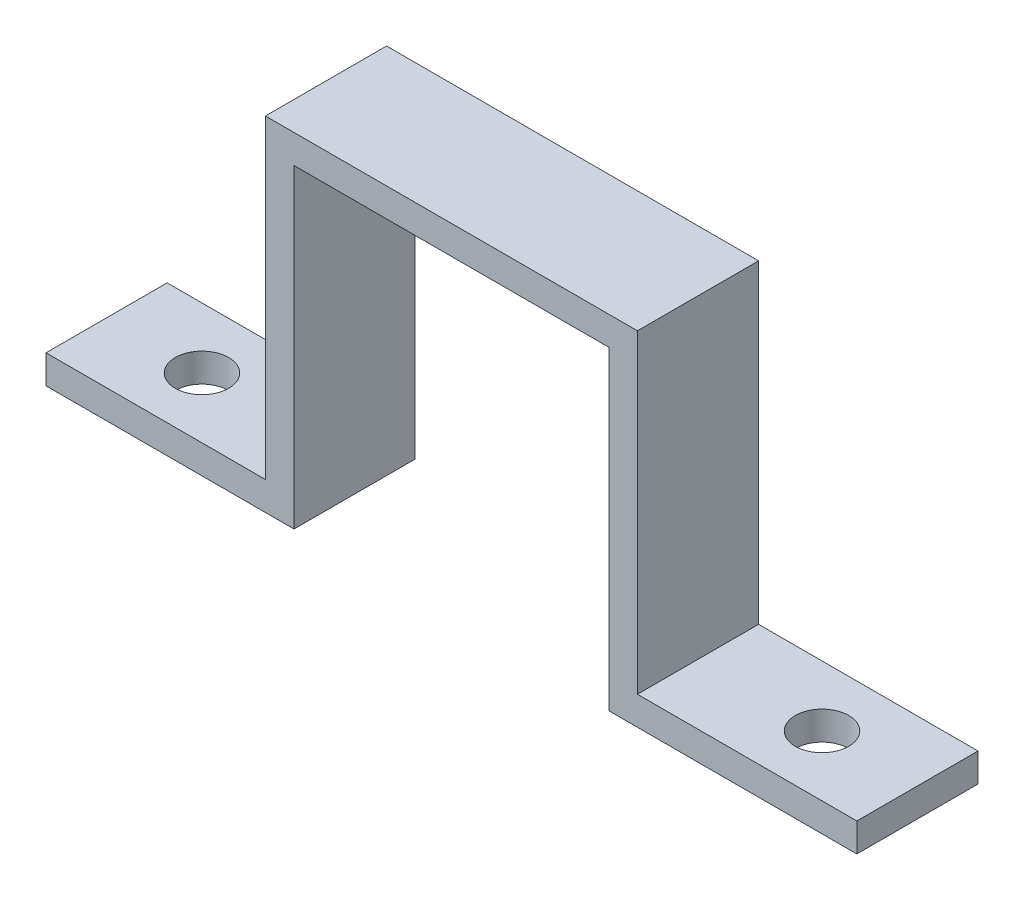
ISO-10303-21;
HEADER;
FILE_DESCRIPTION(('STEP AP214'),'2;1');
FILE_NAME('part.step','',(''),(''),'','','');
FILE_SCHEMA(('AUTOMOTIVE_DESIGN { 1 0 10303 214 1 1 1 1 }'));
ENDSEC;
DATA;
#1=APPLICATION_CONTEXT('core data for automotive mechanical design processes');
#2=APPLICATION_PROTOCOL_DEFINITION('international standard','automotive_design',2000,#1);
#3=PRODUCT_CONTEXT('',#1,'mechanical');
#4=PRODUCT('Part','Part','',(#3));
#5=PRODUCT_RELATED_PRODUCT_CATEGORY('part','',(#4));
#6=PRODUCT_DEFINITION_FORMATION('','',#4);
#7=PRODUCT_DEFINITION_CONTEXT('part definition',#1,'design');
#8=PRODUCT_DEFINITION('design','',#6,#7);
#9=PRODUCT_DEFINITION_SHAPE('','',#8);
#10=(LENGTH_UNIT() NAMED_UNIT(*) SI_UNIT(.MILLI.,.METRE.));
#11=(NAMED_UNIT(*) PLANE_ANGLE_UNIT() SI_UNIT($,.RADIAN.));
#12=(NAMED_UNIT(*) SI_UNIT($,.STERADIAN.) SOLID_ANGLE_UNIT());
#13=UNCERTAINTY_MEASURE_WITH_UNIT(LENGTH_MEASURE(1.E-05),#10,'distance_accuracy_value','');
#14=(GEOMETRIC_REPRESENTATION_CONTEXT(3) GLOBAL_UNCERTAINTY_ASSIGNED_CONTEXT((#13)) GLOBAL_UNIT_ASSIGNED_CONTEXT((#10,
#11,#12)) REPRESENTATION_CONTEXT('',''));
#15=CARTESIAN_POINT('',(0.,0.,0.));
#16=DIRECTION('',(0.,0.,1.));
#17=DIRECTION('',(1.,0.,0.));
#18=AXIS2_PLACEMENT_3D('',#15,#16,#17);
#19=CARTESIAN_POINT('',(-42.5,3.,-6.35));
#20=DIRECTION('',(0.,1.,0.));
#21=DIRECTION('',(0.,0.,1.));
#22=AXIS2_PLACEMENT_3D('',#19,#20,#21);
#23=PLANE('',#22);
#24=CARTESIAN_POINT('',(-32.5,3.,0.));
#25=DIRECTION('',(0.,1.,0.));
#26=DIRECTION('',(0.,0.,1.));
#27=AXIS2_PLACEMENT_3D('',#24,#25,#26);
#28=CIRCLE('',#27,2.8);
#29=CARTESIAN_POINT('',(-32.5,3.,2.8));
#30=VERTEX_POINT('',#29);
#31=EDGE_CURVE('E215',#30,#30,#28,.T.);
#32=ORIENTED_EDGE('',*,*,#31,.F.);
#33=EDGE_LOOP('',(#32));
#34=FACE_BOUND('',#33,.T.);
#35=DIRECTION('',(0.,0.,1.));
#36=VECTOR('',#35,1.);
#37=CARTESIAN_POINT('',(-42.5,3.,-6.35));
#38=LINE('',#37,#36);
#39=CARTESIAN_POINT('',(-42.5,3.,-6.35));
#40=VERTEX_POINT('',#39);
#41=CARTESIAN_POINT('',(-42.5,3.,6.35));
#42=VERTEX_POINT('',#41);
#43=EDGE_CURVE('E120',#40,#42,#38,.T.);
#44=ORIENTED_EDGE('',*,*,#43,.T.);
#45=DIRECTION('',(1.,0.,0.));
#46=VECTOR('',#45,1.);
#47=CARTESIAN_POINT('',(-42.5,3.,6.35));
#48=LINE('',#47,#46);
#49=CARTESIAN_POINT('',(-19.5,3.,6.35));
#50=VERTEX_POINT('',#49);
#51=EDGE_CURVE('E122',#50,#42,#48,.F.);
#52=ORIENTED_EDGE('',*,*,#51,.F.);
#53=DIRECTION('',(0.,0.,1.));
#54=VECTOR('',#53,1.);
#55=CARTESIAN_POINT('',(-19.5,3.,-6.35));
#56=LINE('',#55,#54);
#57=CARTESIAN_POINT('',(-19.5,3.,-6.35));
#58=VERTEX_POINT('',#57);
#59=EDGE_CURVE('E11',#58,#50,#56,.T.);
#60=ORIENTED_EDGE('',*,*,#59,.F.);
#61=DIRECTION('',(1.,0.,0.));
#62=VECTOR('',#61,1.);
#63=CARTESIAN_POINT('',(-42.5,3.,-6.35));
#64=LINE('',#63,#62);
#65=EDGE_CURVE('E123',#58,#40,#64,.F.);
#66=ORIENTED_EDGE('',*,*,#65,.T.);
#67=EDGE_LOOP('',(#44,#52,#60,#66));
#68=FACE_BOUND('',#67,.T.);
#69=ADVANCED_FACE('F33',(#34,#68),#23,.T.);
#70=CARTESIAN_POINT('',(-19.5,0.,-6.35));
#71=DIRECTION('',(-1.,0.,0.));
#72=DIRECTION('',(0.,-1.,0.));
#73=AXIS2_PLACEMENT_3D('',#70,#71,#72);
#74=PLANE('',#73);
#75=ORIENTED_EDGE('',*,*,#59,.T.);
#76=DIRECTION('',(0.,-1.,0.));
#77=VECTOR('',#76,1.);
#78=CARTESIAN_POINT('',(-19.5,0.,6.35));
#79=LINE('',#78,#77);
#80=CARTESIAN_POINT('',(-19.5,36.,6.35));
#81=VERTEX_POINT('',#80);
#82=EDGE_CURVE('E138',#81,#50,#79,.T.);
#83=ORIENTED_EDGE('',*,*,#82,.F.);
#84=DIRECTION('',(0.,0.,1.));
#85=VECTOR('',#84,1.);
#86=CARTESIAN_POINT('',(-19.5,36.,-6.35));
#87=LINE('',#86,#85);
#88=CARTESIAN_POINT('',(-19.5,36.,-6.35));
#89=VERTEX_POINT('',#88);
#90=EDGE_CURVE('E41',#89,#81,#87,.T.);
#91=ORIENTED_EDGE('',*,*,#90,.F.);
#92=DIRECTION('',(0.,-1.,0.));
#93=VECTOR('',#92,1.);
#94=CARTESIAN_POINT('',(-19.5,0.,-6.35));
#95=LINE('',#94,#93);
#96=EDGE_CURVE('E128',#89,#58,#95,.T.);
#97=ORIENTED_EDGE('',*,*,#96,.T.);
#98=EDGE_LOOP('',(#75,#83,#91,#97));
#99=FACE_BOUND('',#98,.T.);
#100=ADVANCED_FACE('F264',(#99),#74,.T.);
#101=CARTESIAN_POINT('',(-16.5,36.,-6.35));
#102=DIRECTION('',(0.,1.,0.));
#103=DIRECTION('',(-1.,0.,0.));
#104=AXIS2_PLACEMENT_3D('',#101,#102,#103);
#105=PLANE('',#104);
#106=ORIENTED_EDGE('',*,*,#90,.T.);
#107=DIRECTION('',(-1.,0.,0.));
#108=VECTOR('',#107,1.);
#109=CARTESIAN_POINT('',(-16.5,36.,6.35));
#110=LINE('',#109,#108);
#111=CARTESIAN_POINT('',(19.5,36.,6.35));
#112=VERTEX_POINT('',#111);
#113=EDGE_CURVE('E169',#112,#81,#110,.T.);
#114=ORIENTED_EDGE('',*,*,#113,.F.);
#115=DIRECTION('',(0.,0.,1.));
#116=VECTOR('',#115,1.);
#117=CARTESIAN_POINT('',(19.5,36.,-6.35));
#118=LINE('',#117,#116);
#119=CARTESIAN_POINT('',(19.5,36.,-6.35));
#120=VERTEX_POINT('',#119);
#121=EDGE_CURVE('E197',#120,#112,#118,.T.);
#122=ORIENTED_EDGE('',*,*,#121,.F.);
#123=DIRECTION('',(-1.,0.,0.));
#124=VECTOR('',#123,1.);
#125=CARTESIAN_POINT('',(-16.5,36.,-6.35));
#126=LINE('',#125,#124);
#127=EDGE_CURVE('E193',#120,#89,#126,.T.);
#128=ORIENTED_EDGE('',*,*,#127,.T.);
#129=EDGE_LOOP('',(#106,#114,#122,#128));
#130=FACE_BOUND('',#129,.T.);
#131=ADVANCED_FACE('F260',(#130),#105,.T.);
#132=CARTESIAN_POINT('',(19.5,0.,-6.35));
#133=DIRECTION('',(1.,0.,0.));
#134=DIRECTION('',(0.,1.,0.));
#135=AXIS2_PLACEMENT_3D('',#132,#133,#134);
#136=PLANE('',#135);
#137=ORIENTED_EDGE('',*,*,#121,.T.);
#138=DIRECTION('',(0.,1.,0.));
#139=VECTOR('',#138,1.);
#140=CARTESIAN_POINT('',(19.5,0.,6.35));
#141=LINE('',#140,#139);
#142=CARTESIAN_POINT('',(19.5,3.,6.35));
#143=VERTEX_POINT('',#142);
#144=EDGE_CURVE('E166',#143,#112,#141,.T.);
#145=ORIENTED_EDGE('',*,*,#144,.F.);
#146=DIRECTION('',(0.,0.,1.));
#147=VECTOR('',#146,1.);
#148=CARTESIAN_POINT('',(19.5,3.,-6.35));
#149=LINE('',#148,#147);
#150=CARTESIAN_POINT('',(19.5,3.,-6.35));
#151=VERTEX_POINT('',#150);
#152=EDGE_CURVE('E199',#151,#143,#149,.T.);
#153=ORIENTED_EDGE('',*,*,#152,.F.);
#154=DIRECTION('',(0.,1.,0.));
#155=VECTOR('',#154,1.);
#156=CARTESIAN_POINT('',(19.5,0.,-6.35));
#157=LINE('',#156,#155);
#158=EDGE_CURVE('E190',#151,#120,#157,.T.);
#159=ORIENTED_EDGE('',*,*,#158,.T.);
#160=EDGE_LOOP('',(#137,#145,#153,#159));
#161=FACE_BOUND('',#160,.T.);
#162=ADVANCED_FACE('F256',(#161),#136,.T.);
#163=CARTESIAN_POINT('',(42.5,3.00000000000001,-6.35));
#164=DIRECTION('',(0.,1.,0.));
#165=DIRECTION('',(-1.,0.,0.));
#166=AXIS2_PLACEMENT_3D('',#163,#164,#165);
#167=PLANE('',#166);
#168=CARTESIAN_POINT('',(32.5,3.00000000000001,0.));
#169=DIRECTION('',(0.,1.,0.));
#170=DIRECTION('',(-1.,0.,0.));
#171=AXIS2_PLACEMENT_3D('',#168,#169,#170);
#172=CIRCLE('',#171,2.8);
#173=CARTESIAN_POINT('',(32.5,3.00000000000001,2.8));
#174=VERTEX_POINT('',#173);
#175=EDGE_CURVE('E139',#174,#174,#172,.F.);
#176=ORIENTED_EDGE('',*,*,#175,.T.);
#177=EDGE_LOOP('',(#176));
#178=FACE_BOUND('',#177,.T.);
#179=ORIENTED_EDGE('',*,*,#152,.T.);
#180=DIRECTION('',(-1.,0.,0.));
#181=VECTOR('',#180,1.);
#182=CARTESIAN_POINT('',(42.5,3.00000000000001,6.35));
#183=LINE('',#182,#181);
#184=CARTESIAN_POINT('',(42.5,3.00000000000001,6.35));
#185=VERTEX_POINT('',#184);
#186=EDGE_CURVE('E163',#185,#143,#183,.T.);
#187=ORIENTED_EDGE('',*,*,#186,.F.);
#188=DIRECTION('',(0.,0.,1.));
#189=VECTOR('',#188,1.);
#190=CARTESIAN_POINT('',(42.5,3.00000000000001,-6.35));
#191=LINE('',#190,#189);
#192=CARTESIAN_POINT('',(42.5,3.00000000000001,-6.35));
#193=VERTEX_POINT('',#192);
#194=EDGE_CURVE('E201',#193,#185,#191,.T.);
#195=ORIENTED_EDGE('',*,*,#194,.F.);
#196=DIRECTION('',(-1.,0.,0.));
#197=VECTOR('',#196,1.);
#198=CARTESIAN_POINT('',(42.5,3.00000000000001,-6.35));
#199=LINE('',#198,#197);
#200=EDGE_CURVE('E187',#193,#151,#199,.T.);
#201=ORIENTED_EDGE('',*,*,#200,.T.);
#202=EDGE_LOOP('',(#179,#187,#195,#201));
#203=FACE_BOUND('',#202,.T.);
#204=ADVANCED_FACE('F226',(#178,#203),#167,.T.);
#205=CARTESIAN_POINT('',(42.5,3.00000000000001,-6.35));
#206=DIRECTION('',(-1.,0.,0.));
#207=DIRECTION('',(0.,0.,1.));
#208=AXIS2_PLACEMENT_3D('',#205,#206,#207);
#209=PLANE('',#208);
#210=ORIENTED_EDGE('',*,*,#194,.T.);
#211=DIRECTION('',(0.,-1.,0.));
#212=VECTOR('',#211,1.);
#213=CARTESIAN_POINT('',(42.5,3.00000000000001,6.35));
#214=LINE('',#213,#212);
#215=CARTESIAN_POINT('',(42.5,0.,6.35));
#216=VERTEX_POINT('',#215);
#217=EDGE_CURVE('E160',#185,#216,#214,.T.);
#218=ORIENTED_EDGE('',*,*,#217,.T.);
#219=DIRECTION('',(0.,0.,1.));
#220=VECTOR('',#219,1.);
#221=CARTESIAN_POINT('',(42.5,0.,-6.35));
#222=LINE('',#221,#220);
#223=CARTESIAN_POINT('',(42.5,0.,-6.35));
#224=VERTEX_POINT('',#223);
#225=EDGE_CURVE('E203',#224,#216,#222,.T.);
#226=ORIENTED_EDGE('',*,*,#225,.F.);
#227=DIRECTION('',(0.,-1.,0.));
#228=VECTOR('',#227,1.);
#229=CARTESIAN_POINT('',(42.5,3.00000000000001,-6.35));
#230=LINE('',#229,#228);
#231=EDGE_CURVE('E185',#193,#224,#230,.T.);
#232=ORIENTED_EDGE('',*,*,#231,.F.);
#233=EDGE_LOOP('',(#210,#218,#226,#232));
#234=FACE_BOUND('',#233,.T.);
#235=ADVANCED_FACE('F240',(#234),#209,.F.);
#236=CARTESIAN_POINT('',(42.5,0.,-6.35));
#237=DIRECTION('',(0.,1.,0.));
#238=DIRECTION('',(-1.,0.,0.));
#239=AXIS2_PLACEMENT_3D('',#236,#237,#238);
#240=PLANE('',#239);
#241=CARTESIAN_POINT('',(32.5,0.,0.));
#242=DIRECTION('',(0.,1.,0.));
#243=DIRECTION('',(-1.,0.,0.));
#244=AXIS2_PLACEMENT_3D('',#241,#242,#243);
#245=CIRCLE('',#244,2.8);
#246=CARTESIAN_POINT('',(32.5,0.,2.8));
#247=VERTEX_POINT('',#246);
#248=EDGE_CURVE('E36',#247,#247,#245,.F.);
#249=ORIENTED_EDGE('',*,*,#248,.F.);
#250=EDGE_LOOP('',(#249));
#251=FACE_BOUND('',#250,.T.);
#252=ORIENTED_EDGE('',*,*,#225,.T.);
#253=DIRECTION('',(-1.,0.,0.));
#254=VECTOR('',#253,1.);
#255=CARTESIAN_POINT('',(42.5,0.,6.35));
#256=LINE('',#255,#254);
#257=CARTESIAN_POINT('',(16.5,0.,6.35));
#258=VERTEX_POINT('',#257);
#259=EDGE_CURVE('E157',#216,#258,#256,.T.);
#260=ORIENTED_EDGE('',*,*,#259,.T.);
#261=DIRECTION('',(0.,0.,1.));
#262=VECTOR('',#261,1.);
#263=CARTESIAN_POINT('',(16.5,0.,-6.35));
#264=LINE('',#263,#262);
#265=CARTESIAN_POINT('',(16.5,0.,-6.35));
#266=VERTEX_POINT('',#265);
#267=EDGE_CURVE('E205',#266,#258,#264,.T.);
#268=ORIENTED_EDGE('',*,*,#267,.F.);
#269=DIRECTION('',(-1.,0.,0.));
#270=VECTOR('',#269,1.);
#271=CARTESIAN_POINT('',(42.5,0.,-6.35));
#272=LINE('',#271,#270);
#273=EDGE_CURVE('E183',#224,#266,#272,.T.);
#274=ORIENTED_EDGE('',*,*,#273,.F.);
#275=EDGE_LOOP('',(#252,#260,#268,#274));
#276=FACE_BOUND('',#275,.T.);
#277=ADVANCED_FACE('F236',(#251,#276),#240,.F.);
#278=CARTESIAN_POINT('',(16.5,0.,-6.35));
#279=DIRECTION('',(1.,0.,0.));
#280=DIRECTION('',(0.,1.,0.));
#281=AXIS2_PLACEMENT_3D('',#278,#279,#280);
#282=PLANE('',#281);
#283=ORIENTED_EDGE('',*,*,#267,.T.);
#284=DIRECTION('',(0.,1.,0.));
#285=VECTOR('',#284,1.);
#286=CARTESIAN_POINT('',(16.5,0.,6.35));
#287=LINE('',#286,#285);
#288=CARTESIAN_POINT('',(16.5,33.,6.35));
#289=VERTEX_POINT('',#288);
#290=EDGE_CURVE('E154',#258,#289,#287,.T.);
#291=ORIENTED_EDGE('',*,*,#290,.T.);
#292=DIRECTION('',(0.,0.,1.));
#293=VECTOR('',#292,1.);
#294=CARTESIAN_POINT('',(16.5,33.,-6.35));
#295=LINE('',#294,#293);
#296=CARTESIAN_POINT('',(16.5,33.,-6.35));
#297=VERTEX_POINT('',#296);
#298=EDGE_CURVE('E207',#297,#289,#295,.T.);
#299=ORIENTED_EDGE('',*,*,#298,.F.);
#300=DIRECTION('',(0.,1.,0.));
#301=VECTOR('',#300,1.);
#302=CARTESIAN_POINT('',(16.5,0.,-6.35));
#303=LINE('',#302,#301);
#304=EDGE_CURVE('E181',#266,#297,#303,.T.);
#305=ORIENTED_EDGE('',*,*,#304,.F.);
#306=EDGE_LOOP('',(#283,#291,#299,#305));
#307=FACE_BOUND('',#306,.T.);
#308=ADVANCED_FACE('F239',(#307),#282,.F.);
#309=CARTESIAN_POINT('',(-16.5,33.,-6.35));
#310=DIRECTION('',(0.,1.,0.));
#311=DIRECTION('',(-1.,0.,0.));
#312=AXIS2_PLACEMENT_3D('',#309,#310,#311);
#313=PLANE('',#312);
#314=ORIENTED_EDGE('',*,*,#298,.T.);
#315=DIRECTION('',(-1.,0.,0.));
#316=VECTOR('',#315,1.);
#317=CARTESIAN_POINT('',(-16.5,33.,6.35));
#318=LINE('',#317,#316);
#319=CARTESIAN_POINT('',(-16.5,33.,6.35));
#320=VERTEX_POINT('',#319);
#321=EDGE_CURVE('E151',#289,#320,#318,.T.);
#322=ORIENTED_EDGE('',*,*,#321,.T.);
#323=DIRECTION('',(0.,0.,1.));
#324=VECTOR('',#323,1.);
#325=CARTESIAN_POINT('',(-16.5,33.,-6.35));
#326=LINE('',#325,#324);
#327=CARTESIAN_POINT('',(-16.5,33.,-6.35));
#328=VERTEX_POINT('',#327);
#329=EDGE_CURVE('E209',#328,#320,#326,.T.);
#330=ORIENTED_EDGE('',*,*,#329,.F.);
#331=DIRECTION('',(-1.,0.,0.));
#332=VECTOR('',#331,1.);
#333=CARTESIAN_POINT('',(-16.5,33.,-6.35));
#334=LINE('',#333,#332);
#335=EDGE_CURVE('E179',#297,#328,#334,.T.);
#336=ORIENTED_EDGE('',*,*,#335,.F.);
#337=EDGE_LOOP('',(#314,#322,#330,#336));
#338=FACE_BOUND('',#337,.T.);
#339=ADVANCED_FACE('F284',(#338),#313,.F.);
#340=CARTESIAN_POINT('',(-16.5,0.,-6.35));
#341=DIRECTION('',(-1.,0.,0.));
#342=DIRECTION('',(0.,-1.,0.));
#343=AXIS2_PLACEMENT_3D('',#340,#341,#342);
#344=PLANE('',#343);
#345=ORIENTED_EDGE('',*,*,#329,.T.);
#346=DIRECTION('',(0.,-1.,0.));
#347=VECTOR('',#346,1.);
#348=CARTESIAN_POINT('',(-16.5,0.,6.35));
#349=LINE('',#348,#347);
#350=CARTESIAN_POINT('',(-16.5,0.,6.35));
#351=VERTEX_POINT('',#350);
#352=EDGE_CURVE('E145',#320,#351,#349,.T.);
#353=ORIENTED_EDGE('',*,*,#352,.T.);
#354=DIRECTION('',(0.,0.,1.));
#355=VECTOR('',#354,1.);
#356=CARTESIAN_POINT('',(-16.5,0.,-6.35));
#357=LINE('',#356,#355);
#358=CARTESIAN_POINT('',(-16.5,0.,-6.35));
#359=VERTEX_POINT('',#358);
#360=EDGE_CURVE('E211',#359,#351,#357,.T.);
#361=ORIENTED_EDGE('',*,*,#360,.F.);
#362=DIRECTION('',(0.,-1.,0.));
#363=VECTOR('',#362,1.);
#364=CARTESIAN_POINT('',(-16.5,0.,-6.35));
#365=LINE('',#364,#363);
#366=EDGE_CURVE('E177',#328,#359,#365,.T.);
#367=ORIENTED_EDGE('',*,*,#366,.F.);
#368=EDGE_LOOP('',(#345,#353,#361,#367));
#369=FACE_BOUND('',#368,.T.);
#370=ADVANCED_FACE('F288',(#369),#344,.F.);
#371=CARTESIAN_POINT('',(-42.5,0.,-6.35));
#372=DIRECTION('',(0.,1.,0.));
#373=DIRECTION('',(0.,0.,1.));
#374=AXIS2_PLACEMENT_3D('',#371,#372,#373);
#375=PLANE('',#374);
#376=CARTESIAN_POINT('',(-32.5,0.,0.));
#377=DIRECTION('',(0.,1.,0.));
#378=DIRECTION('',(0.,0.,1.));
#379=AXIS2_PLACEMENT_3D('',#376,#377,#378);
#380=CIRCLE('',#379,2.8);
#381=CARTESIAN_POINT('',(-32.5,0.,2.8));
#382=VERTEX_POINT('',#381);
#383=EDGE_CURVE('E213',#382,#382,#380,.T.);
#384=ORIENTED_EDGE('',*,*,#383,.T.);
#385=EDGE_LOOP('',(#384));
#386=FACE_BOUND('',#385,.T.);
#387=ORIENTED_EDGE('',*,*,#360,.T.);
#388=DIRECTION('',(-1.,0.,0.));
#389=VECTOR('',#388,1.);
#390=CARTESIAN_POINT('',(-42.5,0.,6.35));
#391=LINE('',#390,#389);
#392=CARTESIAN_POINT('',(-42.5,0.,6.35));
#393=VERTEX_POINT('',#392);
#394=EDGE_CURVE('E143',#351,#393,#391,.T.);
#395=ORIENTED_EDGE('',*,*,#394,.T.);
#396=DIRECTION('',(0.,0.,1.));
#397=VECTOR('',#396,1.);
#398=CARTESIAN_POINT('',(-42.5,0.,-6.35));
#399=LINE('',#398,#397);
#400=CARTESIAN_POINT('',(-42.5,0.,-6.35));
#401=VERTEX_POINT('',#400);
#402=EDGE_CURVE('E127',#401,#393,#399,.T.);
#403=ORIENTED_EDGE('',*,*,#402,.F.);
#404=DIRECTION('',(-1.,0.,0.));
#405=VECTOR('',#404,1.);
#406=CARTESIAN_POINT('',(-42.5,0.,-6.35));
#407=LINE('',#406,#405);
#408=EDGE_CURVE('E175',#359,#401,#407,.T.);
#409=ORIENTED_EDGE('',*,*,#408,.F.);
#410=EDGE_LOOP('',(#387,#395,#403,#409));
#411=FACE_BOUND('',#410,.T.);
#412=ADVANCED_FACE('F292',(#386,#411),#375,.F.);
#413=CARTESIAN_POINT('',(-42.5,0.,-6.35));
#414=DIRECTION('',(1.,0.,0.));
#415=DIRECTION('',(0.,0.,-1.));
#416=AXIS2_PLACEMENT_3D('',#413,#414,#415);
#417=PLANE('',#416);
#418=ORIENTED_EDGE('',*,*,#402,.T.);
#419=DIRECTION('',(0.,1.,0.));
#420=VECTOR('',#419,1.);
#421=CARTESIAN_POINT('',(-42.5,0.,6.35));
#422=LINE('',#421,#420);
#423=EDGE_CURVE('E135',#393,#42,#422,.T.);
#424=ORIENTED_EDGE('',*,*,#423,.T.);
#425=ORIENTED_EDGE('',*,*,#43,.F.);
#426=DIRECTION('',(0.,1.,0.));
#427=VECTOR('',#426,1.);
#428=CARTESIAN_POINT('',(-42.5,0.,-6.35));
#429=LINE('',#428,#427);
#430=EDGE_CURVE('E173',#401,#40,#429,.T.);
#431=ORIENTED_EDGE('',*,*,#430,.F.);
#432=EDGE_LOOP('',(#418,#424,#425,#431));
#433=FACE_BOUND('',#432,.T.);
#434=ADVANCED_FACE('F141',(#433),#417,.F.);
#435=CARTESIAN_POINT('',(0.,0.,-6.35));
#436=DIRECTION('',(0.,0.,1.));
#437=DIRECTION('',(1.,0.,0.));
#438=AXIS2_PLACEMENT_3D('',#435,#436,#437);
#439=PLANE('',#438);
#440=ORIENTED_EDGE('',*,*,#65,.F.);
#441=ORIENTED_EDGE('',*,*,#96,.F.);
#442=ORIENTED_EDGE('',*,*,#127,.F.);
#443=ORIENTED_EDGE('',*,*,#158,.F.);
#444=ORIENTED_EDGE('',*,*,#200,.F.);
#445=ORIENTED_EDGE('',*,*,#231,.T.);
#446=ORIENTED_EDGE('',*,*,#273,.T.);
#447=ORIENTED_EDGE('',*,*,#304,.T.);
#448=ORIENTED_EDGE('',*,*,#335,.T.);
#449=ORIENTED_EDGE('',*,*,#366,.T.);
#450=ORIENTED_EDGE('',*,*,#408,.T.);
#451=ORIENTED_EDGE('',*,*,#430,.T.);
#452=EDGE_LOOP('',(#440,#441,#442,#443,#444,#445,#446,#447,#448,#449,#450,#451));
#453=FACE_BOUND('',#452,.T.);
#454=ADVANCED_FACE('F263',(#453),#439,.F.);
#455=CARTESIAN_POINT('',(0.,0.,6.35));
#456=DIRECTION('',(0.,0.,1.));
#457=DIRECTION('',(1.,0.,0.));
#458=AXIS2_PLACEMENT_3D('',#455,#456,#457);
#459=PLANE('',#458);
#460=ORIENTED_EDGE('',*,*,#51,.T.);
#461=ORIENTED_EDGE('',*,*,#423,.F.);
#462=ORIENTED_EDGE('',*,*,#394,.F.);
#463=ORIENTED_EDGE('',*,*,#352,.F.);
#464=ORIENTED_EDGE('',*,*,#321,.F.);
#465=ORIENTED_EDGE('',*,*,#290,.F.);
#466=ORIENTED_EDGE('',*,*,#259,.F.);
#467=ORIENTED_EDGE('',*,*,#217,.F.);
#468=ORIENTED_EDGE('',*,*,#186,.T.);
#469=ORIENTED_EDGE('',*,*,#144,.T.);
#470=ORIENTED_EDGE('',*,*,#113,.T.);
#471=ORIENTED_EDGE('',*,*,#82,.T.);
#472=EDGE_LOOP('',(#460,#461,#462,#463,#464,#465,#466,#467,#468,#469,#470,#471));
#473=FACE_BOUND('',#472,.T.);
#474=ADVANCED_FACE('F133',(#473),#459,.T.);
#475=CARTESIAN_POINT('',(-32.5,-1.2E-05,0.));
#476=DIRECTION('',(0.,1.,0.));
#477=DIRECTION('',(0.,0.,1.));
#478=AXIS2_PLACEMENT_3D('',#475,#476,#477);
#479=CYLINDRICAL_SURFACE('',#478,2.8);
#480=CARTESIAN_POINT('',(-32.5,3.,2.8));
#481=CARTESIAN_POINT('',(-32.5,2.96875,2.8));
#482=CARTESIAN_POINT('',(-32.5,2.9375,2.8));
#483=CARTESIAN_POINT('',(-32.5,2.875,2.8));
#484=CARTESIAN_POINT('',(-32.5,2.84375,2.8));
#485=CARTESIAN_POINT('',(-32.5,2.78125,2.8));
#486=CARTESIAN_POINT('',(-32.5,2.75,2.8));
#487=CARTESIAN_POINT('',(-32.5,2.6875,2.8));
#488=CARTESIAN_POINT('',(-32.5,2.65625,2.8));
#489=CARTESIAN_POINT('',(-32.5,2.59375,2.8));
#490=CARTESIAN_POINT('',(-32.5,2.5625,2.8));
#491=CARTESIAN_POINT('',(-32.5,2.5,2.8));
#492=CARTESIAN_POINT('',(-32.5,2.46875,2.8));
#493=CARTESIAN_POINT('',(-32.5,2.40625,2.8));
#494=CARTESIAN_POINT('',(-32.5,2.375,2.8));
#495=CARTESIAN_POINT('',(-32.5,2.3125,2.8));
#496=CARTESIAN_POINT('',(-32.5,2.28125,2.8));
#497=CARTESIAN_POINT('',(-32.5,2.21875,2.8));
#498=CARTESIAN_POINT('',(-32.5,2.1875,2.8));
#499=CARTESIAN_POINT('',(-32.5,2.125,2.8));
#500=CARTESIAN_POINT('',(-32.5,2.09375,2.8));
#501=CARTESIAN_POINT('',(-32.5,2.03125,2.8));
#502=CARTESIAN_POINT('',(-32.5,2.,2.8));
#503=CARTESIAN_POINT('',(-32.5,1.9375,2.8));
#504=CARTESIAN_POINT('',(-32.5,1.90625,2.8));
#505=CARTESIAN_POINT('',(-32.5,1.84375,2.8));
#506=CARTESIAN_POINT('',(-32.5,1.8125,2.8));
#507=CARTESIAN_POINT('',(-32.5,1.75,2.8));
#508=CARTESIAN_POINT('',(-32.5,1.71875,2.8));
#509=CARTESIAN_POINT('',(-32.5,1.65625,2.8));
#510=CARTESIAN_POINT('',(-32.5,1.625,2.8));
#511=CARTESIAN_POINT('',(-32.5,1.5625,2.8));
#512=CARTESIAN_POINT('',(-32.5,1.53125,2.8));
#513=CARTESIAN_POINT('',(-32.5,1.46875,2.8));
#514=CARTESIAN_POINT('',(-32.5,1.4375,2.8));
#515=CARTESIAN_POINT('',(-32.5,1.375,2.8));
#516=CARTESIAN_POINT('',(-32.5,1.34375,2.8));
#517=CARTESIAN_POINT('',(-32.5,1.28125,2.8));
#518=CARTESIAN_POINT('',(-32.5,1.25,2.8));
#519=CARTESIAN_POINT('',(-32.5,1.1875,2.8));
#520=CARTESIAN_POINT('',(-32.5,1.15625,2.8));
#521=CARTESIAN_POINT('',(-32.5,1.09375,2.8));
#522=CARTESIAN_POINT('',(-32.5,1.0625,2.8));
#523=CARTESIAN_POINT('',(-32.5,1.,2.8));
#524=CARTESIAN_POINT('',(-32.5,0.96875,2.8));
#525=CARTESIAN_POINT('',(-32.5,0.90625,2.8));
#526=CARTESIAN_POINT('',(-32.5,0.875,2.8));
#527=CARTESIAN_POINT('',(-32.5,0.8125,2.8));
#528=CARTESIAN_POINT('',(-32.5,0.78125,2.8));
#529=CARTESIAN_POINT('',(-32.5,0.71875,2.8));
#530=CARTESIAN_POINT('',(-32.5,0.6875,2.8));
#531=CARTESIAN_POINT('',(-32.5,0.625,2.8));
#532=CARTESIAN_POINT('',(-32.5,0.59375,2.8));
#533=CARTESIAN_POINT('',(-32.5,0.53125,2.8));
#534=CARTESIAN_POINT('',(-32.5,0.5,2.8));
#535=CARTESIAN_POINT('',(-32.5,0.4375,2.8));
#536=CARTESIAN_POINT('',(-32.5,0.40625,2.8));
#537=CARTESIAN_POINT('',(-32.5,0.34375,2.8));
#538=CARTESIAN_POINT('',(-32.5,0.3125,2.8));
#539=CARTESIAN_POINT('',(-32.5,0.25,2.8));
#540=CARTESIAN_POINT('',(-32.5,0.21875,2.8));
#541=CARTESIAN_POINT('',(-32.5,0.15625,2.8));
#542=CARTESIAN_POINT('',(-32.5,0.125,2.8));
#543=CARTESIAN_POINT('',(-32.5,0.0625000000000002,2.8));
#544=CARTESIAN_POINT('',(-32.5,0.0312500000000002,2.8));
#545=CARTESIAN_POINT('',(-32.5,0.,2.8));
#546=B_SPLINE_CURVE_WITH_KNOTS('',3,(#480,#481,#482,#483,#484,#485,#486,#487,#488,#489,#490,
#491,#492,#493,#494,#495,#496,#497,#498,#499,#500,#501,#502,#503,#504,#505,#506,#507,#508,#509,
#510,#511,#512,#513,#514,#515,#516,#517,#518,#519,#520,#521,#522,#523,#524,#525,#526,#527,#528,
#529,#530,#531,#532,#533,#534,#535,#536,#537,#538,#539,#540,#541,#542,#543,#544,#545),
.UNSPECIFIED.,.F.,.F.,(4,2,2,2,2,2,2,2,2,2,2,2,2,2,2,2,2,2,2,2,2,2,2,2,2,2,2,2,2,2,2,2,4),(0.,
0.0937500000000001,0.1875,0.28125,0.375,0.46875,0.5625,0.65625,0.75,0.84375,0.9375,1.03125,
1.125,1.21875,1.3125,1.40625,1.5,1.59375,1.6875,1.78125,1.875,1.96875,2.0625,2.15625,2.25,
2.34375,2.4375,2.53125,2.625,2.71875,2.8125,2.90625,3.),.UNSPECIFIED.);
#547=EDGE_CURVE('BSEAM232',#30,#382,#546,.T.);
#548=ORIENTED_EDGE('',*,*,#31,.T.);
#549=ORIENTED_EDGE('',*,*,#383,.F.);
#550=ORIENTED_EDGE('',*,*,#547,.T.);
#551=ORIENTED_EDGE('',*,*,#547,.F.);
#552=EDGE_LOOP('',(#548,#550,#549,#551));
#553=FACE_BOUND('',#552,.T.);
#554=ADVANCED_FACE('F232',(#553),#479,.F.);
#555=CARTESIAN_POINT('',(32.5,-1.2E-05,0.));
#556=DIRECTION('',(0.,1.,0.));
#557=DIRECTION('',(0.,0.,1.));
#558=AXIS2_PLACEMENT_3D('',#555,#556,#557);
#559=CYLINDRICAL_SURFACE('',#558,2.8);
#560=CARTESIAN_POINT('',(32.5,3.00000000000001,2.8));
#561=CARTESIAN_POINT('',(32.5,2.96875000000001,2.8));
#562=CARTESIAN_POINT('',(32.5,2.93750000000001,2.8));
#563=CARTESIAN_POINT('',(32.5,2.87500000000001,2.8));
#564=CARTESIAN_POINT('',(32.5,2.84375000000001,2.8));
#565=CARTESIAN_POINT('',(32.5,2.78125000000001,2.8));
#566=CARTESIAN_POINT('',(32.5,2.75000000000001,2.8));
#567=CARTESIAN_POINT('',(32.5,2.68750000000001,2.8));
#568=CARTESIAN_POINT('',(32.5,2.65625000000001,2.8));
#569=CARTESIAN_POINT('',(32.5,2.59375000000001,2.8));
#570=CARTESIAN_POINT('',(32.5,2.56250000000001,2.8));
#571=CARTESIAN_POINT('',(32.5,2.50000000000001,2.8));
#572=CARTESIAN_POINT('',(32.5,2.46875000000001,2.8));
#573=CARTESIAN_POINT('',(32.5,2.40625000000001,2.8));
#574=CARTESIAN_POINT('',(32.5,2.37500000000001,2.8));
#575=CARTESIAN_POINT('',(32.5,2.31250000000001,2.8));
#576=CARTESIAN_POINT('',(32.5,2.28125000000001,2.8));
#577=CARTESIAN_POINT('',(32.5,2.21875000000001,2.8));
#578=CARTESIAN_POINT('',(32.5,2.18750000000001,2.8));
#579=CARTESIAN_POINT('',(32.5,2.12500000000001,2.8));
#580=CARTESIAN_POINT('',(32.5,2.09375000000001,2.8));
#581=CARTESIAN_POINT('',(32.5,2.03125000000001,2.8));
#582=CARTESIAN_POINT('',(32.5,2.00000000000001,2.8));
#583=CARTESIAN_POINT('',(32.5,1.93750000000001,2.8));
#584=CARTESIAN_POINT('',(32.5,1.90625000000001,2.8));
#585=CARTESIAN_POINT('',(32.5,1.84375000000001,2.8));
#586=CARTESIAN_POINT('',(32.5,1.81250000000001,2.8));
#587=CARTESIAN_POINT('',(32.5,1.75000000000001,2.8));
#588=CARTESIAN_POINT('',(32.5,1.71875000000001,2.8));
#589=CARTESIAN_POINT('',(32.5,1.65625000000001,2.8));
#590=CARTESIAN_POINT('',(32.5,1.62500000000001,2.8));
#591=CARTESIAN_POINT('',(32.5,1.56250000000001,2.8));
#592=CARTESIAN_POINT('',(32.5,1.53125000000001,2.8));
#593=CARTESIAN_POINT('',(32.5,1.46875000000001,2.8));
#594=CARTESIAN_POINT('',(32.5,1.43750000000001,2.8));
#595=CARTESIAN_POINT('',(32.5,1.37500000000001,2.8));
#596=CARTESIAN_POINT('',(32.5,1.34375000000001,2.8));
#597=CARTESIAN_POINT('',(32.5,1.28125000000001,2.8));
#598=CARTESIAN_POINT('',(32.5,1.25000000000001,2.8));
#599=CARTESIAN_POINT('',(32.5,1.18750000000001,2.8));
#600=CARTESIAN_POINT('',(32.5,1.15625000000001,2.8));
#601=CARTESIAN_POINT('',(32.5,1.09375000000001,2.8));
#602=CARTESIAN_POINT('',(32.5,1.06250000000001,2.8));
#603=CARTESIAN_POINT('',(32.5,1.00000000000001,2.8));
#604=CARTESIAN_POINT('',(32.5,0.968750000000006,2.8));
#605=CARTESIAN_POINT('',(32.5,0.906250000000006,2.8));
#606=CARTESIAN_POINT('',(32.5,0.875000000000006,2.8));
#607=CARTESIAN_POINT('',(32.5,0.812500000000006,2.8));
#608=CARTESIAN_POINT('',(32.5,0.781250000000006,2.8));
#609=CARTESIAN_POINT('',(32.5,0.718750000000006,2.8));
#610=CARTESIAN_POINT('',(32.5,0.687500000000006,2.8));
#611=CARTESIAN_POINT('',(32.5,0.625000000000006,2.8));
#612=CARTESIAN_POINT('',(32.5,0.593750000000006,2.8));
#613=CARTESIAN_POINT('',(32.5,0.531250000000006,2.8));
#614=CARTESIAN_POINT('',(32.5,0.500000000000006,2.8));
#615=CARTESIAN_POINT('',(32.5,0.437500000000006,2.8));
#616=CARTESIAN_POINT('',(32.5,0.406250000000006,2.8));
#617=CARTESIAN_POINT('',(32.5,0.343750000000006,2.8));
#618=CARTESIAN_POINT('',(32.5,0.312500000000006,2.8));
#619=CARTESIAN_POINT('',(32.5,0.250000000000006,2.8));
#620=CARTESIAN_POINT('',(32.5,0.218750000000006,2.8));
#621=CARTESIAN_POINT('',(32.5,0.156250000000006,2.8));
#622=CARTESIAN_POINT('',(32.5,0.125000000000006,2.8));
#623=CARTESIAN_POINT('',(32.5,0.0625000000000063,2.8));
#624=CARTESIAN_POINT('',(32.5,0.0312500000000063,2.8));
#625=CARTESIAN_POINT('',(32.5,0.,2.8));
#626=B_SPLINE_CURVE_WITH_KNOTS('',3,(#560,#561,#562,#563,#564,#565,#566,#567,#568,#569,#570,
#571,#572,#573,#574,#575,#576,#577,#578,#579,#580,#581,#582,#583,#584,#585,#586,#587,#588,#589,
#590,#591,#592,#593,#594,#595,#596,#597,#598,#599,#600,#601,#602,#603,#604,#605,#606,#607,#608,
#609,#610,#611,#612,#613,#614,#615,#616,#617,#618,#619,#620,#621,#622,#623,#624,#625),
.UNSPECIFIED.,.F.,.F.,(4,2,2,2,2,2,2,2,2,2,2,2,2,2,2,2,2,2,2,2,2,2,2,2,2,2,2,2,2,2,2,2,4),(0.,
0.0937500000000001,0.1875,0.28125,0.375,0.46875,0.5625,0.65625,0.75,0.84375,0.9375,1.03125,
1.125,1.21875,1.3125,1.40625,1.5,1.59375,1.6875,1.78125,1.875,1.96875,2.0625,2.15625,2.25,
2.34375,2.4375,2.53125,2.625,2.71875,2.8125,2.90625,3.),.UNSPECIFIED.);
#627=EDGE_CURVE('BSEAM229',#174,#247,#626,.T.);
#628=ORIENTED_EDGE('',*,*,#175,.F.);
#629=ORIENTED_EDGE('',*,*,#248,.T.);
#630=ORIENTED_EDGE('',*,*,#627,.T.);
#631=ORIENTED_EDGE('',*,*,#627,.F.);
#632=EDGE_LOOP('',(#628,#630,#629,#631));
#633=FACE_BOUND('',#632,.T.);
#634=ADVANCED_FACE('F229',(#633),#559,.F.);
#635=CLOSED_SHELL('',(#69,#100,#131,#162,#204,#235,#277,#308,#339,#370,#412,#434,#454,#474,#554,#634));
#636=MANIFOLD_SOLID_BREP('B2',#635);
#637=ADVANCED_BREP_SHAPE_REPRESENTATION('',(#18,#636),#14);
#638=SHAPE_DEFINITION_REPRESENTATION(#9,#637);
ENDSEC;
END-ISO-10303-21;
